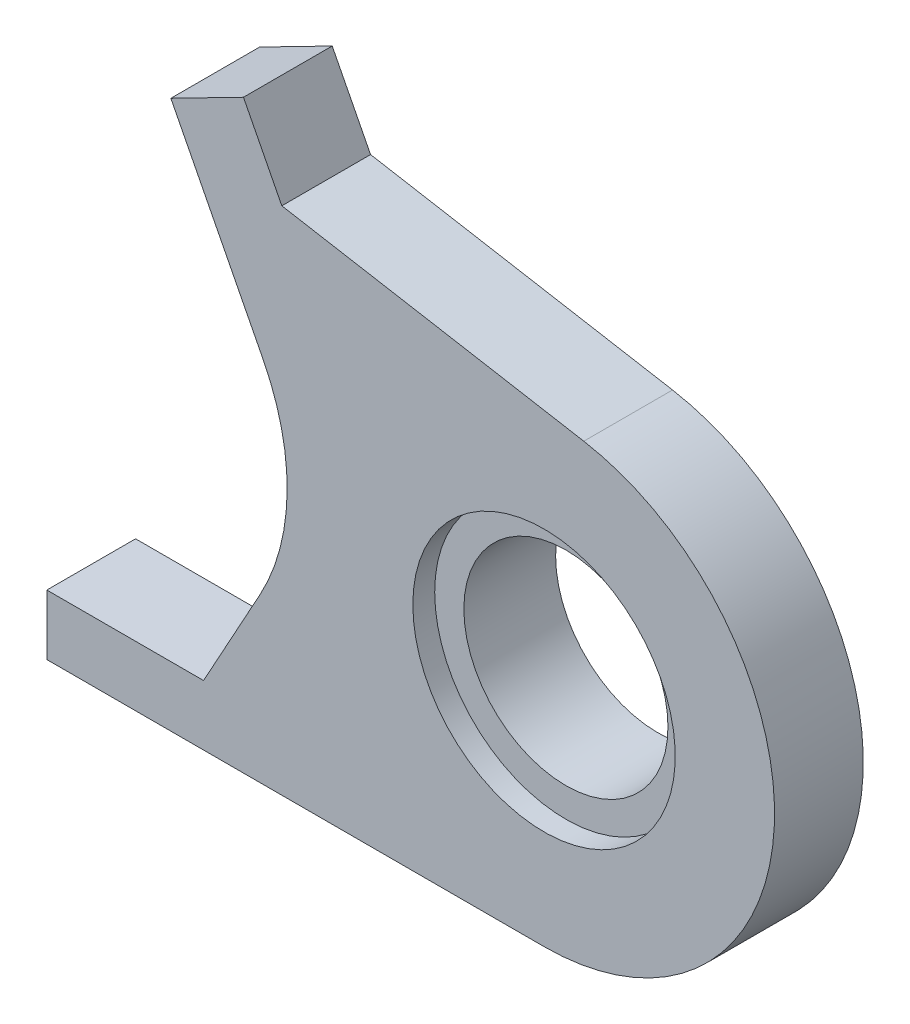
ISO-10303-21;
HEADER;
FILE_DESCRIPTION(('STEP AP214'),'2;1');
FILE_NAME('part.step','',(''),(''),'','','');
FILE_SCHEMA(('AUTOMOTIVE_DESIGN { 1 0 10303 214 1 1 1 1 }'));
ENDSEC;
DATA;
#1=APPLICATION_CONTEXT('core data for automotive mechanical design processes');
#2=APPLICATION_PROTOCOL_DEFINITION('international standard','automotive_design',2000,#1);
#3=PRODUCT_CONTEXT('',#1,'mechanical');
#4=PRODUCT('Part','Part','',(#3));
#5=PRODUCT_RELATED_PRODUCT_CATEGORY('part','',(#4));
#6=PRODUCT_DEFINITION_FORMATION('','',#4);
#7=PRODUCT_DEFINITION_CONTEXT('part definition',#1,'design');
#8=PRODUCT_DEFINITION('design','',#6,#7);
#9=PRODUCT_DEFINITION_SHAPE('','',#8);
#10=(LENGTH_UNIT() NAMED_UNIT(*) SI_UNIT(.MILLI.,.METRE.));
#11=(NAMED_UNIT(*) PLANE_ANGLE_UNIT() SI_UNIT($,.RADIAN.));
#12=(NAMED_UNIT(*) SI_UNIT($,.STERADIAN.) SOLID_ANGLE_UNIT());
#13=UNCERTAINTY_MEASURE_WITH_UNIT(LENGTH_MEASURE(1.E-05),#10,'distance_accuracy_value','');
#14=(GEOMETRIC_REPRESENTATION_CONTEXT(3) GLOBAL_UNCERTAINTY_ASSIGNED_CONTEXT((#13)) GLOBAL_UNIT_ASSIGNED_CONTEXT((#10,
#11,#12)) REPRESENTATION_CONTEXT('',''));
#15=CARTESIAN_POINT('',(0.,0.,0.));
#16=DIRECTION('',(0.,0.,1.));
#17=DIRECTION('',(1.,0.,0.));
#18=AXIS2_PLACEMENT_3D('',#15,#16,#17);
#19=CARTESIAN_POINT('',(-158.113565581673,0.,29.7957587899811));
#20=DIRECTION('',(0.,0.,1.));
#21=DIRECTION('',(1.,0.,0.));
#22=AXIS2_PLACEMENT_3D('',#19,#20,#21);
#23=PLANE('',#22);
#24=CARTESIAN_POINT('',(0.,0.,29.7957587899811));
#25=DIRECTION('',(0.,0.,-1.));
#26=DIRECTION('',(-1.,0.,0.));
#27=AXIS2_PLACEMENT_3D('',#24,#25,#26);
#28=CIRCLE('',#27,90.);
#29=CARTESIAN_POINT('',(-90.,0.,29.7957587899811));
#30=VERTEX_POINT('',#29);
#31=EDGE_CURVE('E11',#30,#30,#28,.T.);
#32=ORIENTED_EDGE('',*,*,#31,.T.);
#33=EDGE_LOOP('',(#32));
#34=FACE_BOUND('',#33,.T.);
#35=CARTESIAN_POINT('',(0.,0.,29.7957587899811));
#36=DIRECTION('',(0.,0.,-1.));
#37=DIRECTION('',(-1.,0.,0.));
#38=AXIS2_PLACEMENT_3D('',#35,#36,#37);
#39=CIRCLE('',#38,158.113565581673);
#40=CARTESIAN_POINT('',(27.2702398044838,155.74412875597,29.7957587899811));
#41=VERTEX_POINT('',#40);
#42=CARTESIAN_POINT('',(0.,-158.113565581673,29.7957587899811));
#43=VERTEX_POINT('',#42);
#44=EDGE_CURVE('E200',#41,#43,#39,.T.);
#45=ORIENTED_EDGE('',*,*,#44,.F.);
#46=DIRECTION('',(0.985014335632829,-0.172472486495139,0.));
#47=VECTOR('',#46,1.);
#48=CARTESIAN_POINT('',(-179.847269567244,192.009663729197,29.7957587899811));
#49=LINE('',#48,#47);
#50=CARTESIAN_POINT('',(-179.847269567244,192.009663729197,29.7957587899811));
#51=VERTEX_POINT('',#50);
#52=EDGE_CURVE('E177',#51,#41,#49,.T.);
#53=ORIENTED_EDGE('',*,*,#52,.F.);
#54=DIRECTION('',(0.456097643995416,-0.889929738317487,0.));
#55=VECTOR('',#54,1.);
#56=CARTESIAN_POINT('',(-206.159608851798,243.349839505809,29.7957587899811));
#57=LINE('',#56,#55);
#58=CARTESIAN_POINT('',(-206.159608851798,243.349839505809,29.7957587899811));
#59=VERTEX_POINT('',#58);
#60=EDGE_CURVE('E126',#59,#51,#57,.T.);
#61=ORIENTED_EDGE('',*,*,#60,.F.);
#62=DIRECTION('',(0.889929738317487,0.456097643995416,0.));
#63=VECTOR('',#62,1.);
#64=CARTESIAN_POINT('',(-255.959925104742,217.826693199745,29.7957587899811));
#65=LINE('',#64,#63);
#66=CARTESIAN_POINT('',(-255.959925104742,217.826693199745,29.7957587899811));
#67=VERTEX_POINT('',#66);
#68=EDGE_CURVE('E120',#67,#59,#65,.T.);
#69=ORIENTED_EDGE('',*,*,#68,.F.);
#70=DIRECTION('',(-0.456097643995416,0.889929738317487,0.));
#71=VECTOR('',#70,1.);
#72=CARTESIAN_POINT('',(-192.698265470347,94.3916504076075,29.7957587899811));
#73=LINE('',#72,#71);
#74=CARTESIAN_POINT('',(-192.698265470347,94.3916504076075,29.7957587899811));
#75=VERTEX_POINT('',#74);
#76=EDGE_CURVE('E123',#75,#67,#73,.T.);
#77=ORIENTED_EDGE('',*,*,#76,.F.);
#78=CARTESIAN_POINT('',(-326.18772621797,25.9770038082945,29.7957587899811));
#79=DIRECTION('',(0.,0.,1.));
#80=DIRECTION('',(1.,0.,0.));
#81=AXIS2_PLACEMENT_3D('',#78,#79,#80);
#82=CIRCLE('',#81,150.);
#83=CARTESIAN_POINT('',(-194.760807878014,-46.3207495154618,29.7957587899811));
#84=VERTEX_POINT('',#83);
#85=EDGE_CURVE('E154',#84,#75,#82,.T.);
#86=ORIENTED_EDGE('',*,*,#85,.F.);
#87=DIRECTION('',(0.481985022158372,0.876179455599704,0.));
#88=VECTOR('',#87,1.);
#89=CARTESIAN_POINT('',(-233.535117417818,-116.806868091729,29.7957587899811));
#90=LINE('',#89,#88);
#91=CARTESIAN_POINT('',(-233.535117417818,-116.806868091729,29.7957587899811));
#92=VERTEX_POINT('',#91);
#93=EDGE_CURVE('E157',#92,#84,#90,.T.);
#94=ORIENTED_EDGE('',*,*,#93,.F.);
#95=DIRECTION('',(1.,0.,0.));
#96=VECTOR('',#95,1.);
#97=CARTESIAN_POINT('',(-341.027566011832,-116.806868091729,29.7957587899811));
#98=LINE('',#97,#96);
#99=CARTESIAN_POINT('',(-341.027566011832,-116.806868091729,29.7957587899811));
#100=VERTEX_POINT('',#99);
#101=EDGE_CURVE('E162',#100,#92,#98,.T.);
#102=ORIENTED_EDGE('',*,*,#101,.F.);
#103=DIRECTION('',(0.,1.,0.));
#104=VECTOR('',#103,1.);
#105=CARTESIAN_POINT('',(-341.027566011832,-158.113565581673,29.7957587899811));
#106=LINE('',#105,#104);
#107=CARTESIAN_POINT('',(-341.027566011832,-158.113565581673,29.7957587899811));
#108=VERTEX_POINT('',#107);
#109=EDGE_CURVE('E167',#108,#100,#106,.T.);
#110=ORIENTED_EDGE('',*,*,#109,.F.);
#111=DIRECTION('',(-1.,0.,0.));
#112=VECTOR('',#111,1.);
#113=CARTESIAN_POINT('',(0.,-158.113565581673,29.7957587899811));
#114=LINE('',#113,#112);
#115=EDGE_CURVE('E172',#43,#108,#114,.T.);
#116=ORIENTED_EDGE('',*,*,#115,.F.);
#117=EDGE_LOOP('',(#45,#53,#61,#69,#77,#86,#94,#102,#110,#116));
#118=FACE_BOUND('',#117,.T.);
#119=ADVANCED_FACE('F45',(#34,#118),#23,.T.);
#120=CARTESIAN_POINT('',(0.,0.,0.));
#121=DIRECTION('',(0.,0.,-1.));
#122=DIRECTION('',(-1.,0.,0.));
#123=AXIS2_PLACEMENT_3D('',#120,#121,#122);
#124=CYLINDRICAL_SURFACE('',#123,90.);
#125=CARTESIAN_POINT('',(0.,0.,14.7957587899811));
#126=DIRECTION('',(0.,0.,-1.));
#127=DIRECTION('',(-1.,0.,0.));
#128=AXIS2_PLACEMENT_3D('',#125,#126,#127);
#129=CIRCLE('',#128,90.);
#130=CARTESIAN_POINT('',(-90.,0.,14.7957587899811));
#131=VERTEX_POINT('',#130);
#132=EDGE_CURVE('E53',#131,#131,#129,.T.);
#133=ORIENTED_EDGE('',*,*,#132,.T.);
#134=EDGE_LOOP('',(#133));
#135=FACE_BOUND('',#134,.T.);
#136=ORIENTED_EDGE('',*,*,#31,.F.);
#137=EDGE_LOOP('',(#136));
#138=FACE_BOUND('',#137,.T.);
#139=ADVANCED_FACE('F225',(#135,#138),#124,.F.);
#140=CARTESIAN_POINT('',(-90.,0.,14.7957587899811));
#141=DIRECTION('',(0.,0.,1.));
#142=DIRECTION('',(1.,0.,0.));
#143=AXIS2_PLACEMENT_3D('',#140,#141,#142);
#144=PLANE('',#143);
#145=CARTESIAN_POINT('',(0.,0.,14.7957587899811));
#146=DIRECTION('',(0.,0.,-1.));
#147=DIRECTION('',(-1.,0.,0.));
#148=AXIS2_PLACEMENT_3D('',#145,#146,#147);
#149=CIRCLE('',#148,70.);
#150=CARTESIAN_POINT('',(-70.,0.,14.7957587899811));
#151=VERTEX_POINT('',#150);
#152=EDGE_CURVE('E218',#151,#151,#149,.T.);
#153=ORIENTED_EDGE('',*,*,#152,.T.);
#154=EDGE_LOOP('',(#153));
#155=FACE_BOUND('',#154,.T.);
#156=ORIENTED_EDGE('',*,*,#132,.F.);
#157=EDGE_LOOP('',(#156));
#158=FACE_BOUND('',#157,.T.);
#159=ADVANCED_FACE('F228',(#155,#158),#144,.T.);
#160=CARTESIAN_POINT('',(0.,0.,0.));
#161=DIRECTION('',(0.,0.,-1.));
#162=DIRECTION('',(-1.,0.,0.));
#163=AXIS2_PLACEMENT_3D('',#160,#161,#162);
#164=CYLINDRICAL_SURFACE('',#163,70.);
#165=CARTESIAN_POINT('',(0.,0.,-48.1404103110511));
#166=DIRECTION('',(0.,0.,-1.));
#167=DIRECTION('',(-1.,0.,0.));
#168=AXIS2_PLACEMENT_3D('',#165,#166,#167);
#169=CIRCLE('',#168,70.);
#170=CARTESIAN_POINT('',(-70.,0.,-48.1404103110511));
#171=VERTEX_POINT('',#170);
#172=EDGE_CURVE('E214',#171,#171,#169,.T.);
#173=ORIENTED_EDGE('',*,*,#172,.T.);
#174=EDGE_LOOP('',(#173));
#175=FACE_BOUND('',#174,.T.);
#176=ORIENTED_EDGE('',*,*,#152,.F.);
#177=EDGE_LOOP('',(#176));
#178=FACE_BOUND('',#177,.T.);
#179=ADVANCED_FACE('F230',(#175,#178),#164,.F.);
#180=CARTESIAN_POINT('',(-70.,0.,-48.1404103110511));
#181=DIRECTION('',(0.,0.,-1.));
#182=DIRECTION('',(-1.,0.,0.));
#183=AXIS2_PLACEMENT_3D('',#180,#181,#182);
#184=PLANE('',#183);
#185=CARTESIAN_POINT('',(0.,0.,-48.1404103110511));
#186=DIRECTION('',(0.,0.,-1.));
#187=DIRECTION('',(-1.,0.,0.));
#188=AXIS2_PLACEMENT_3D('',#185,#186,#187);
#189=CIRCLE('',#188,99.097023168706);
#190=CARTESIAN_POINT('',(-99.097023168706,0.,-48.1404103110511));
#191=VERTEX_POINT('',#190);
#192=EDGE_CURVE('E210',#191,#191,#189,.T.);
#193=ORIENTED_EDGE('',*,*,#192,.T.);
#194=EDGE_LOOP('',(#193));
#195=FACE_BOUND('',#194,.T.);
#196=ORIENTED_EDGE('',*,*,#172,.F.);
#197=EDGE_LOOP('',(#196));
#198=FACE_BOUND('',#197,.T.);
#199=ADVANCED_FACE('F237',(#195,#198),#184,.T.);
#200=CARTESIAN_POINT('',(0.,0.,0.));
#201=DIRECTION('',(0.,0.,-1.));
#202=DIRECTION('',(-1.,0.,0.));
#203=AXIS2_PLACEMENT_3D('',#200,#201,#202);
#204=CYLINDRICAL_SURFACE('',#203,99.097023168706);
#205=CARTESIAN_POINT('',(0.,0.,-31.0695096130853));
#206=DIRECTION('',(0.,0.,-1.));
#207=DIRECTION('',(-1.,0.,0.));
#208=AXIS2_PLACEMENT_3D('',#205,#206,#207);
#209=CIRCLE('',#208,99.097023168706);
#210=CARTESIAN_POINT('',(-99.097023168706,0.,-31.0695096130853));
#211=VERTEX_POINT('',#210);
#212=EDGE_CURVE('E206',#211,#211,#209,.T.);
#213=ORIENTED_EDGE('',*,*,#212,.T.);
#214=EDGE_LOOP('',(#213));
#215=FACE_BOUND('',#214,.T.);
#216=ORIENTED_EDGE('',*,*,#192,.F.);
#217=EDGE_LOOP('',(#216));
#218=FACE_BOUND('',#217,.T.);
#219=ADVANCED_FACE('F252',(#215,#218),#204,.T.);
#220=CARTESIAN_POINT('',(-99.097023168706,0.,-31.0695096130853));
#221=DIRECTION('',(0.,0.,-1.));
#222=DIRECTION('',(-1.,0.,0.));
#223=AXIS2_PLACEMENT_3D('',#220,#221,#222);
#224=PLANE('',#223);
#225=CARTESIAN_POINT('',(0.,0.,-31.0695096130853));
#226=DIRECTION('',(0.,0.,-1.));
#227=DIRECTION('',(-1.,0.,0.));
#228=AXIS2_PLACEMENT_3D('',#225,#226,#227);
#229=CIRCLE('',#228,158.113565581673);
#230=CARTESIAN_POINT('',(27.2702398044834,155.74412875597,-31.0695096130853));
#231=VERTEX_POINT('',#230);
#232=CARTESIAN_POINT('',(0.,-158.113565581673,-31.0695096130853));
#233=VERTEX_POINT('',#232);
#234=EDGE_CURVE('E64',#231,#233,#229,.T.);
#235=ORIENTED_EDGE('',*,*,#234,.T.);
#236=DIRECTION('',(-1.,0.,0.));
#237=VECTOR('',#236,1.);
#238=CARTESIAN_POINT('',(0.,-158.113565581673,-31.0695096130853));
#239=LINE('',#238,#237);
#240=CARTESIAN_POINT('',(-341.027566011832,-158.113565581673,-31.0695096130853));
#241=VERTEX_POINT('',#240);
#242=EDGE_CURVE('E420',#233,#241,#239,.T.);
#243=ORIENTED_EDGE('',*,*,#242,.T.);
#244=DIRECTION('',(0.,1.,0.));
#245=VECTOR('',#244,1.);
#246=CARTESIAN_POINT('',(-341.027566011832,-158.113565581673,-31.0695096130853));
#247=LINE('',#246,#245);
#248=CARTESIAN_POINT('',(-341.027566011832,-116.806868091729,-31.0695096130853));
#249=VERTEX_POINT('',#248);
#250=EDGE_CURVE('E424',#241,#249,#247,.T.);
#251=ORIENTED_EDGE('',*,*,#250,.T.);
#252=DIRECTION('',(1.,0.,0.));
#253=VECTOR('',#252,1.);
#254=CARTESIAN_POINT('',(-341.027566011832,-116.806868091729,-31.0695096130853));
#255=LINE('',#254,#253);
#256=CARTESIAN_POINT('',(-233.535117417818,-116.806868091729,-31.0695096130853));
#257=VERTEX_POINT('',#256);
#258=EDGE_CURVE('E428',#249,#257,#255,.T.);
#259=ORIENTED_EDGE('',*,*,#258,.T.);
#260=DIRECTION('',(0.481985022158372,0.876179455599704,0.));
#261=VECTOR('',#260,1.);
#262=CARTESIAN_POINT('',(-233.535117417818,-116.806868091729,-31.0695096130853));
#263=LINE('',#262,#261);
#264=CARTESIAN_POINT('',(-194.760807878014,-46.3207495154618,-31.0695096130853));
#265=VERTEX_POINT('',#264);
#266=EDGE_CURVE('E203',#257,#265,#263,.T.);
#267=ORIENTED_EDGE('',*,*,#266,.T.);
#268=CARTESIAN_POINT('',(-326.18772621797,25.9770038082945,-31.0695096130853));
#269=DIRECTION('',(0.,0.,1.));
#270=DIRECTION('',(1.,0.,0.));
#271=AXIS2_PLACEMENT_3D('',#268,#269,#270);
#272=CIRCLE('',#271,150.);
#273=CARTESIAN_POINT('',(-192.698265470347,94.3916504076075,-31.0695096130853));
#274=VERTEX_POINT('',#273);
#275=EDGE_CURVE('E142',#265,#274,#272,.T.);
#276=ORIENTED_EDGE('',*,*,#275,.T.);
#277=DIRECTION('',(-0.456097643995416,0.889929738317487,0.));
#278=VECTOR('',#277,1.);
#279=CARTESIAN_POINT('',(-192.698265470347,94.3916504076075,-31.0695096130853));
#280=LINE('',#279,#278);
#281=CARTESIAN_POINT('',(-255.959925104742,217.826693199745,-31.0695096130853));
#282=VERTEX_POINT('',#281);
#283=EDGE_CURVE('E413',#274,#282,#280,.T.);
#284=ORIENTED_EDGE('',*,*,#283,.T.);
#285=DIRECTION('',(0.889929738317487,0.456097643995416,0.));
#286=VECTOR('',#285,1.);
#287=CARTESIAN_POINT('',(-255.959925104742,217.826693199745,-31.0695096130853));
#288=LINE('',#287,#286);
#289=CARTESIAN_POINT('',(-206.159608851798,243.349839505809,-31.0695096130853));
#290=VERTEX_POINT('',#289);
#291=EDGE_CURVE('E137',#282,#290,#288,.T.);
#292=ORIENTED_EDGE('',*,*,#291,.T.);
#293=DIRECTION('',(0.456097643995416,-0.889929738317487,0.));
#294=VECTOR('',#293,1.);
#295=CARTESIAN_POINT('',(-206.159608851798,243.349839505809,-31.0695096130853));
#296=LINE('',#295,#294);
#297=CARTESIAN_POINT('',(-179.847269567244,192.009663729197,-31.0695096130853));
#298=VERTEX_POINT('',#297);
#299=EDGE_CURVE('E405',#290,#298,#296,.T.);
#300=ORIENTED_EDGE('',*,*,#299,.T.);
#301=DIRECTION('',(0.985014335632829,-0.172472486495139,0.));
#302=VECTOR('',#301,1.);
#303=CARTESIAN_POINT('',(-179.847269567244,192.009663729197,-31.0695096130853));
#304=LINE('',#303,#302);
#305=EDGE_CURVE('E410',#298,#231,#304,.T.);
#306=ORIENTED_EDGE('',*,*,#305,.T.);
#307=EDGE_LOOP('',(#235,#243,#251,#259,#267,#276,#284,#292,#300,#306));
#308=FACE_BOUND('',#307,.T.);
#309=ORIENTED_EDGE('',*,*,#212,.F.);
#310=EDGE_LOOP('',(#309));
#311=FACE_BOUND('',#310,.T.);
#312=ADVANCED_FACE('F256',(#308,#311),#224,.T.);
#313=CARTESIAN_POINT('',(0.,0.,0.));
#314=DIRECTION('',(0.,0.,-1.));
#315=DIRECTION('',(-1.,0.,0.));
#316=AXIS2_PLACEMENT_3D('',#313,#314,#315);
#317=CYLINDRICAL_SURFACE('',#316,158.113565581673);
#318=DIRECTION('',(0.,0.,-1.));
#319=VECTOR('',#318,1.);
#320=CARTESIAN_POINT('',(0.,-158.113565581673,670.35390203139));
#321=LINE('',#320,#319);
#322=EDGE_CURVE('E60',#43,#233,#321,.T.);
#323=ORIENTED_EDGE('',*,*,#322,.T.);
#324=ORIENTED_EDGE('',*,*,#234,.F.);
#325=DIRECTION('',(0.,0.,-1.));
#326=VECTOR('',#325,1.);
#327=CARTESIAN_POINT('',(27.2702398044838,155.74412875597,670.35390203139));
#328=LINE('',#327,#326);
#329=EDGE_CURVE('E181',#41,#231,#328,.T.);
#330=ORIENTED_EDGE('',*,*,#329,.F.);
#331=ORIENTED_EDGE('',*,*,#44,.T.);
#332=EDGE_LOOP('',(#323,#324,#330,#331));
#333=FACE_BOUND('',#332,.T.);
#334=ADVANCED_FACE('F259',(#333),#317,.T.);
#335=CARTESIAN_POINT('',(-326.18772621797,25.9770038082945,670.35390203139));
#336=DIRECTION('',(0.,0.,-1.));
#337=DIRECTION('',(-1.,0.,0.));
#338=AXIS2_PLACEMENT_3D('',#335,#336,#337);
#339=CYLINDRICAL_SURFACE('',#338,150.);
#340=DIRECTION('',(0.,0.,-1.));
#341=VECTOR('',#340,1.);
#342=CARTESIAN_POINT('',(-194.760807878014,-46.3207495154618,670.35390203139));
#343=LINE('',#342,#341);
#344=EDGE_CURVE('E161',#84,#265,#343,.T.);
#345=ORIENTED_EDGE('',*,*,#344,.F.);
#346=ORIENTED_EDGE('',*,*,#85,.T.);
#347=DIRECTION('',(0.,0.,-1.));
#348=VECTOR('',#347,1.);
#349=CARTESIAN_POINT('',(-192.698265470347,94.3916504076075,670.35390203139));
#350=LINE('',#349,#348);
#351=EDGE_CURVE('E146',#75,#274,#350,.T.);
#352=ORIENTED_EDGE('',*,*,#351,.T.);
#353=ORIENTED_EDGE('',*,*,#275,.F.);
#354=EDGE_LOOP('',(#345,#346,#352,#353));
#355=FACE_BOUND('',#354,.T.);
#356=ADVANCED_FACE('F268',(#355),#339,.F.);
#357=CARTESIAN_POINT('',(-233.535117417818,-116.806868091729,670.35390203139));
#358=DIRECTION('',(-0.876179455599704,0.481985022158372,0.));
#359=DIRECTION('',(-0.481985022158372,-0.876179455599704,0.));
#360=AXIS2_PLACEMENT_3D('',#357,#358,#359);
#361=PLANE('',#360);
#362=DIRECTION('',(0.,0.,-1.));
#363=VECTOR('',#362,1.);
#364=CARTESIAN_POINT('',(-233.535117417818,-116.806868091729,670.35390203139));
#365=LINE('',#364,#363);
#366=EDGE_CURVE('E166',#92,#257,#365,.T.);
#367=ORIENTED_EDGE('',*,*,#366,.F.);
#368=ORIENTED_EDGE('',*,*,#93,.T.);
#369=ORIENTED_EDGE('',*,*,#344,.T.);
#370=ORIENTED_EDGE('',*,*,#266,.F.);
#371=EDGE_LOOP('',(#367,#368,#369,#370));
#372=FACE_BOUND('',#371,.T.);
#373=ADVANCED_FACE('F275',(#372),#361,.T.);
#374=CARTESIAN_POINT('',(-341.027566011832,-116.806868091729,670.35390203139));
#375=DIRECTION('',(0.,1.,0.));
#376=DIRECTION('',(0.,0.,1.));
#377=AXIS2_PLACEMENT_3D('',#374,#375,#376);
#378=PLANE('',#377);
#379=DIRECTION('',(0.,0.,-1.));
#380=VECTOR('',#379,1.);
#381=CARTESIAN_POINT('',(-341.027566011832,-116.806868091729,670.35390203139));
#382=LINE('',#381,#380);
#383=EDGE_CURVE('E171',#100,#249,#382,.T.);
#384=ORIENTED_EDGE('',*,*,#383,.F.);
#385=ORIENTED_EDGE('',*,*,#101,.T.);
#386=ORIENTED_EDGE('',*,*,#366,.T.);
#387=ORIENTED_EDGE('',*,*,#258,.F.);
#388=EDGE_LOOP('',(#384,#385,#386,#387));
#389=FACE_BOUND('',#388,.T.);
#390=ADVANCED_FACE('F284',(#389),#378,.T.);
#391=CARTESIAN_POINT('',(-341.027566011832,-158.113565581673,670.35390203139));
#392=DIRECTION('',(-1.,0.,0.));
#393=DIRECTION('',(0.,-1.,0.));
#394=AXIS2_PLACEMENT_3D('',#391,#392,#393);
#395=PLANE('',#394);
#396=DIRECTION('',(0.,0.,-1.));
#397=VECTOR('',#396,1.);
#398=CARTESIAN_POINT('',(-341.027566011832,-158.113565581673,670.35390203139));
#399=LINE('',#398,#397);
#400=EDGE_CURVE('E176',#108,#241,#399,.T.);
#401=ORIENTED_EDGE('',*,*,#400,.F.);
#402=ORIENTED_EDGE('',*,*,#109,.T.);
#403=ORIENTED_EDGE('',*,*,#383,.T.);
#404=ORIENTED_EDGE('',*,*,#250,.F.);
#405=EDGE_LOOP('',(#401,#402,#403,#404));
#406=FACE_BOUND('',#405,.T.);
#407=ADVANCED_FACE('F293',(#406),#395,.T.);
#408=CARTESIAN_POINT('',(0.,-158.113565581673,670.35390203139));
#409=DIRECTION('',(0.,-1.,0.));
#410=DIRECTION('',(1.,0.,0.));
#411=AXIS2_PLACEMENT_3D('',#408,#409,#410);
#412=PLANE('',#411);
#413=ORIENTED_EDGE('',*,*,#322,.F.);
#414=ORIENTED_EDGE('',*,*,#115,.T.);
#415=ORIENTED_EDGE('',*,*,#400,.T.);
#416=ORIENTED_EDGE('',*,*,#242,.F.);
#417=EDGE_LOOP('',(#413,#414,#415,#416));
#418=FACE_BOUND('',#417,.T.);
#419=ADVANCED_FACE('F302',(#418),#412,.T.);
#420=CARTESIAN_POINT('',(-179.847269567244,192.009663729197,670.35390203139));
#421=DIRECTION('',(0.172472486495139,0.985014335632829,0.));
#422=DIRECTION('',(-0.985014335632829,0.172472486495139,0.));
#423=AXIS2_PLACEMENT_3D('',#420,#421,#422);
#424=PLANE('',#423);
#425=DIRECTION('',(0.,0.,-1.));
#426=VECTOR('',#425,1.);
#427=CARTESIAN_POINT('',(-179.847269567244,192.009663729197,670.35390203139));
#428=LINE('',#427,#426);
#429=EDGE_CURVE('E131',#51,#298,#428,.T.);
#430=ORIENTED_EDGE('',*,*,#429,.F.);
#431=ORIENTED_EDGE('',*,*,#52,.T.);
#432=ORIENTED_EDGE('',*,*,#329,.T.);
#433=ORIENTED_EDGE('',*,*,#305,.F.);
#434=EDGE_LOOP('',(#430,#431,#432,#433));
#435=FACE_BOUND('',#434,.T.);
#436=ADVANCED_FACE('F311',(#435),#424,.T.);
#437=CARTESIAN_POINT('',(-206.159608851798,243.349839505809,670.35390203139));
#438=DIRECTION('',(0.889929738317487,0.456097643995416,0.));
#439=DIRECTION('',(-0.456097643995416,0.889929738317487,0.));
#440=AXIS2_PLACEMENT_3D('',#437,#438,#439);
#441=PLANE('',#440);
#442=DIRECTION('',(0.,0.,-1.));
#443=VECTOR('',#442,1.);
#444=CARTESIAN_POINT('',(-206.159608851798,243.349839505809,670.35390203139));
#445=LINE('',#444,#443);
#446=EDGE_CURVE('E130',#59,#290,#445,.T.);
#447=ORIENTED_EDGE('',*,*,#446,.F.);
#448=ORIENTED_EDGE('',*,*,#60,.T.);
#449=ORIENTED_EDGE('',*,*,#429,.T.);
#450=ORIENTED_EDGE('',*,*,#299,.F.);
#451=EDGE_LOOP('',(#447,#448,#449,#450));
#452=FACE_BOUND('',#451,.T.);
#453=ADVANCED_FACE('F320',(#452),#441,.T.);
#454=CARTESIAN_POINT('',(-255.959925104742,217.826693199745,670.35390203139));
#455=DIRECTION('',(-0.456097643995416,0.889929738317487,0.));
#456=DIRECTION('',(-0.889929738317487,-0.456097643995416,0.));
#457=AXIS2_PLACEMENT_3D('',#454,#455,#456);
#458=PLANE('',#457);
#459=DIRECTION('',(0.,0.,-1.));
#460=VECTOR('',#459,1.);
#461=CARTESIAN_POINT('',(-255.959925104742,217.826693199745,670.35390203139));
#462=LINE('',#461,#460);
#463=EDGE_CURVE('E134',#67,#282,#462,.T.);
#464=ORIENTED_EDGE('',*,*,#463,.F.);
#465=ORIENTED_EDGE('',*,*,#68,.T.);
#466=ORIENTED_EDGE('',*,*,#446,.T.);
#467=ORIENTED_EDGE('',*,*,#291,.F.);
#468=EDGE_LOOP('',(#464,#465,#466,#467));
#469=FACE_BOUND('',#468,.T.);
#470=ADVANCED_FACE('F135',(#469),#458,.T.);
#471=CARTESIAN_POINT('',(-192.698265470347,94.3916504076075,670.35390203139));
#472=DIRECTION('',(-0.889929738317487,-0.456097643995416,0.));
#473=DIRECTION('',(0.456097643995416,-0.889929738317487,0.));
#474=AXIS2_PLACEMENT_3D('',#471,#472,#473);
#475=PLANE('',#474);
#476=ORIENTED_EDGE('',*,*,#351,.F.);
#477=ORIENTED_EDGE('',*,*,#76,.T.);
#478=ORIENTED_EDGE('',*,*,#463,.T.);
#479=ORIENTED_EDGE('',*,*,#283,.F.);
#480=EDGE_LOOP('',(#476,#477,#478,#479));
#481=FACE_BOUND('',#480,.T.);
#482=ADVANCED_FACE('F145',(#481),#475,.T.);
#483=CLOSED_SHELL('',(#119,#139,#159,#179,#199,#219,#312,#334,#356,#373,#390,#407,#419,#436,
#453,#470,#482));
#484=MANIFOLD_SOLID_BREP('B2',#483);
#485=ADVANCED_BREP_SHAPE_REPRESENTATION('',(#18,#484),#14);
#486=SHAPE_DEFINITION_REPRESENTATION(#9,#485);
ENDSEC;
END-ISO-10303-21;
